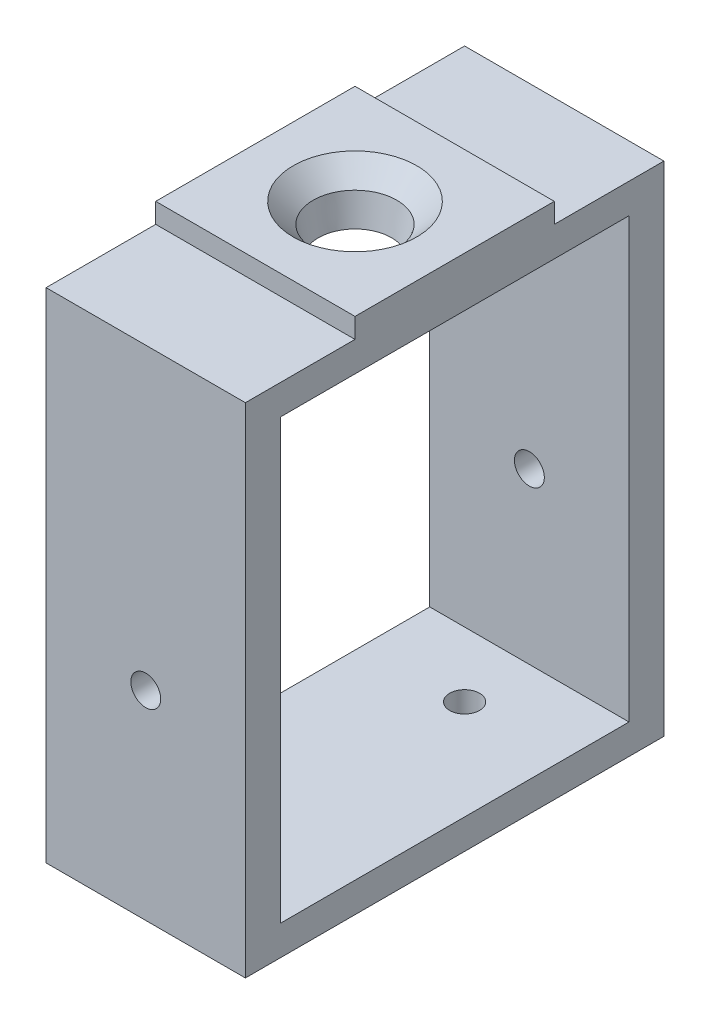
ISO-10303-21;
HEADER;
FILE_DESCRIPTION(('STEP AP214'),'2;1');
FILE_NAME('part.step','',(''),(''),'','','');
FILE_SCHEMA(('AUTOMOTIVE_DESIGN { 1 0 10303 214 1 1 1 1 }'));
ENDSEC;
DATA;
#1=APPLICATION_CONTEXT('core data for automotive mechanical design processes');
#2=APPLICATION_PROTOCOL_DEFINITION('international standard','automotive_design',2000,#1);
#3=PRODUCT_CONTEXT('',#1,'mechanical');
#4=PRODUCT('Part','Part','',(#3));
#5=PRODUCT_RELATED_PRODUCT_CATEGORY('part','',(#4));
#6=PRODUCT_DEFINITION_FORMATION('','',#4);
#7=PRODUCT_DEFINITION_CONTEXT('part definition',#1,'design');
#8=PRODUCT_DEFINITION('design','',#6,#7);
#9=PRODUCT_DEFINITION_SHAPE('','',#8);
#10=(LENGTH_UNIT() NAMED_UNIT(*) SI_UNIT(.MILLI.,.METRE.));
#11=(NAMED_UNIT(*) PLANE_ANGLE_UNIT() SI_UNIT($,.RADIAN.));
#12=(NAMED_UNIT(*) SI_UNIT($,.STERADIAN.) SOLID_ANGLE_UNIT());
#13=UNCERTAINTY_MEASURE_WITH_UNIT(LENGTH_MEASURE(1.E-05),#10,'distance_accuracy_value','');
#14=(GEOMETRIC_REPRESENTATION_CONTEXT(3) GLOBAL_UNCERTAINTY_ASSIGNED_CONTEXT((#13)) GLOBAL_UNIT_ASSIGNED_CONTEXT((#10,
#11,#12)) REPRESENTATION_CONTEXT('',''));
#15=CARTESIAN_POINT('',(0.,0.,0.));
#16=DIRECTION('',(0.,0.,1.));
#17=DIRECTION('',(1.,0.,0.));
#18=AXIS2_PLACEMENT_3D('',#15,#16,#17);
#19=CARTESIAN_POINT('',(0.,50.,0.));
#20=DIRECTION('',(0.,-1.,0.));
#21=DIRECTION('',(0.,0.,-1.));
#22=AXIS2_PLACEMENT_3D('',#19,#20,#21);
#23=PLANE('',#22);
#24=DIRECTION('',(-1.,0.,0.));
#25=VECTOR('',#24,1.);
#26=CARTESIAN_POINT('',(0.,50.,11.));
#27=LINE('',#26,#25);
#28=CARTESIAN_POINT('',(20.,50.,11.));
#29=VERTEX_POINT('',#28);
#30=CARTESIAN_POINT('',(-1.22669731515503E-13,50.,11.));
#31=VERTEX_POINT('',#30);
#32=EDGE_CURVE('E51',#29,#31,#27,.T.);
#33=ORIENTED_EDGE('',*,*,#32,.F.);
#34=DIRECTION('',(0.,0.,-1.));
#35=VECTOR('',#34,1.);
#36=CARTESIAN_POINT('',(20.,50.,42.));
#37=LINE('',#36,#35);
#38=CARTESIAN_POINT('',(20.,50.,0.));
#39=VERTEX_POINT('',#38);
#40=EDGE_CURVE('E188',#29,#39,#37,.T.);
#41=ORIENTED_EDGE('',*,*,#40,.T.);
#42=DIRECTION('',(-1.,0.,0.));
#43=VECTOR('',#42,1.);
#44=CARTESIAN_POINT('',(20.,50.,0.));
#45=LINE('',#44,#43);
#46=CARTESIAN_POINT('',(0.,50.,0.));
#47=VERTEX_POINT('',#46);
#48=EDGE_CURVE('E173',#39,#47,#45,.T.);
#49=ORIENTED_EDGE('',*,*,#48,.T.);
#50=DIRECTION('',(0.,0.,1.));
#51=VECTOR('',#50,1.);
#52=CARTESIAN_POINT('',(0.,50.,42.));
#53=LINE('',#52,#51);
#54=EDGE_CURVE('E183',#47,#31,#53,.T.);
#55=ORIENTED_EDGE('',*,*,#54,.T.);
#56=EDGE_LOOP('',(#33,#41,#49,#55));
#57=FACE_BOUND('',#56,.T.);
#58=ADVANCED_FACE('F35',(#57),#23,.F.);
#59=DIRECTION('',(1.,0.,0.));
#60=VECTOR('',#59,1.);
#61=CARTESIAN_POINT('',(0.,50.,31.));
#62=LINE('',#61,#60);
#63=CARTESIAN_POINT('',(0.,50.,31.));
#64=VERTEX_POINT('',#63);
#65=CARTESIAN_POINT('',(20.,50.,31.));
#66=VERTEX_POINT('',#65);
#67=EDGE_CURVE('E59',#64,#66,#62,.T.);
#68=ORIENTED_EDGE('',*,*,#67,.F.);
#69=CARTESIAN_POINT('',(0.,50.,42.));
#70=VERTEX_POINT('',#69);
#71=EDGE_CURVE('E147',#64,#70,#53,.T.);
#72=ORIENTED_EDGE('',*,*,#71,.T.);
#73=DIRECTION('',(1.,0.,0.));
#74=VECTOR('',#73,1.);
#75=CARTESIAN_POINT('',(0.,50.,42.));
#76=LINE('',#75,#74);
#77=CARTESIAN_POINT('',(20.,50.,42.));
#78=VERTEX_POINT('',#77);
#79=EDGE_CURVE('E185',#70,#78,#76,.T.);
#80=ORIENTED_EDGE('',*,*,#79,.T.);
#81=EDGE_CURVE('E189',#78,#66,#37,.T.);
#82=ORIENTED_EDGE('',*,*,#81,.T.);
#83=EDGE_LOOP('',(#68,#72,#80,#82));
#84=FACE_BOUND('',#83,.T.);
#85=ADVANCED_FACE('F294',(#84),#23,.F.);
#86=CARTESIAN_POINT('',(0.,3.,0.));
#87=DIRECTION('',(0.,1.,0.));
#88=DIRECTION('',(0.,0.,1.));
#89=AXIS2_PLACEMENT_3D('',#86,#87,#88);
#90=PLANE('',#89);
#91=CARTESIAN_POINT('',(10.,3.,10.));
#92=DIRECTION('',(0.,-1.,0.));
#93=DIRECTION('',(0.,0.,-1.));
#94=AXIS2_PLACEMENT_3D('',#91,#92,#93);
#95=CIRCLE('',#94,1.5);
#96=CARTESIAN_POINT('',(10.,3.,8.5));
#97=VERTEX_POINT('',#96);
#98=EDGE_CURVE('E257',#97,#97,#95,.T.);
#99=ORIENTED_EDGE('',*,*,#98,.T.);
#100=EDGE_LOOP('',(#99));
#101=FACE_BOUND('',#100,.T.);
#102=CARTESIAN_POINT('',(10.,3.,32.));
#103=DIRECTION('',(0.,-1.,0.));
#104=DIRECTION('',(0.,0.,-1.));
#105=AXIS2_PLACEMENT_3D('',#102,#103,#104);
#106=CIRCLE('',#105,1.5);
#107=CARTESIAN_POINT('',(10.,3.,30.5));
#108=VERTEX_POINT('',#107);
#109=EDGE_CURVE('E253',#108,#108,#106,.T.);
#110=ORIENTED_EDGE('',*,*,#109,.T.);
#111=EDGE_LOOP('',(#110));
#112=FACE_BOUND('',#111,.T.);
#113=DIRECTION('',(0.,0.,-1.));
#114=VECTOR('',#113,1.);
#115=CARTESIAN_POINT('',(20.,3.,0.));
#116=LINE('',#115,#114);
#117=CARTESIAN_POINT('',(20.,3.,38.5));
#118=VERTEX_POINT('',#117);
#119=CARTESIAN_POINT('',(20.,3.,3.5));
#120=VERTEX_POINT('',#119);
#121=EDGE_CURVE('E201',#118,#120,#116,.T.);
#122=ORIENTED_EDGE('',*,*,#121,.T.);
#123=DIRECTION('',(1.,0.,0.));
#124=VECTOR('',#123,1.);
#125=CARTESIAN_POINT('',(20.,3.,3.5));
#126=LINE('',#125,#124);
#127=CARTESIAN_POINT('',(0.,3.,3.5));
#128=VERTEX_POINT('',#127);
#129=EDGE_CURVE('E172',#128,#120,#126,.T.);
#130=ORIENTED_EDGE('',*,*,#129,.F.);
#131=DIRECTION('',(0.,0.,1.));
#132=VECTOR('',#131,1.);
#133=CARTESIAN_POINT('',(0.,3.,0.));
#134=LINE('',#133,#132);
#135=CARTESIAN_POINT('',(0.,3.,38.5));
#136=VERTEX_POINT('',#135);
#137=EDGE_CURVE('E198',#128,#136,#134,.T.);
#138=ORIENTED_EDGE('',*,*,#137,.T.);
#139=DIRECTION('',(-1.,0.,0.));
#140=VECTOR('',#139,1.);
#141=CARTESIAN_POINT('',(0.,3.,38.5));
#142=LINE('',#141,#140);
#143=EDGE_CURVE('E182',#118,#136,#142,.T.);
#144=ORIENTED_EDGE('',*,*,#143,.F.);
#145=EDGE_LOOP('',(#122,#130,#138,#144));
#146=FACE_BOUND('',#145,.T.);
#147=ADVANCED_FACE('F266',(#101,#112,#146),#90,.T.);
#148=CARTESIAN_POINT('',(0.,3.,0.));
#149=DIRECTION('',(1.,0.,0.));
#150=DIRECTION('',(0.,0.,-1.));
#151=AXIS2_PLACEMENT_3D('',#148,#149,#150);
#152=PLANE('',#151);
#153=DIRECTION('',(0.,0.,-1.));
#154=VECTOR('',#153,1.);
#155=CARTESIAN_POINT('',(0.,47.,38.5));
#156=LINE('',#155,#154);
#157=CARTESIAN_POINT('',(0.,47.,38.5));
#158=VERTEX_POINT('',#157);
#159=CARTESIAN_POINT('',(0.,47.,3.50000000000001));
#160=VERTEX_POINT('',#159);
#161=EDGE_CURVE('E151',#158,#160,#156,.T.);
#162=ORIENTED_EDGE('',*,*,#161,.F.);
#163=DIRECTION('',(0.,-1.,0.));
#164=VECTOR('',#163,1.);
#165=CARTESIAN_POINT('',(0.,50.,38.5));
#166=LINE('',#165,#164);
#167=EDGE_CURVE('E191',#158,#136,#166,.T.);
#168=ORIENTED_EDGE('',*,*,#167,.T.);
#169=ORIENTED_EDGE('',*,*,#137,.F.);
#170=DIRECTION('',(0.,-1.,0.));
#171=VECTOR('',#170,1.);
#172=CARTESIAN_POINT('',(0.,50.,3.5));
#173=LINE('',#172,#171);
#174=EDGE_CURVE('E180',#160,#128,#173,.T.);
#175=ORIENTED_EDGE('',*,*,#174,.F.);
#176=EDGE_LOOP('',(#162,#168,#169,#175));
#177=FACE_BOUND('',#176,.T.);
#178=DIRECTION('',(0.,0.,1.));
#179=VECTOR('',#178,1.);
#180=CARTESIAN_POINT('',(0.,0.,0.));
#181=LINE('',#180,#179);
#182=CARTESIAN_POINT('',(0.,0.,0.));
#183=VERTEX_POINT('',#182);
#184=CARTESIAN_POINT('',(0.,0.,42.));
#185=VERTEX_POINT('',#184);
#186=EDGE_CURVE('E197',#183,#185,#181,.T.);
#187=ORIENTED_EDGE('',*,*,#186,.T.);
#188=DIRECTION('',(0.,-1.,0.));
#189=VECTOR('',#188,1.);
#190=CARTESIAN_POINT('',(0.,3.,42.));
#191=LINE('',#190,#189);
#192=EDGE_CURVE('E11',#70,#185,#191,.T.);
#193=ORIENTED_EDGE('',*,*,#192,.F.);
#194=ORIENTED_EDGE('',*,*,#71,.F.);
#195=DIRECTION('',(0.,-1.,0.));
#196=VECTOR('',#195,1.);
#197=CARTESIAN_POINT('',(0.,52.,31.));
#198=LINE('',#197,#196);
#199=CARTESIAN_POINT('',(0.,52.,31.));
#200=VERTEX_POINT('',#199);
#201=EDGE_CURVE('E129',#200,#64,#198,.T.);
#202=ORIENTED_EDGE('',*,*,#201,.F.);
#203=DIRECTION('',(0.,0.,1.));
#204=VECTOR('',#203,1.);
#205=CARTESIAN_POINT('',(0.,52.,31.));
#206=LINE('',#205,#204);
#207=CARTESIAN_POINT('',(0.,52.,11.));
#208=VERTEX_POINT('',#207);
#209=EDGE_CURVE('E135',#208,#200,#206,.T.);
#210=ORIENTED_EDGE('',*,*,#209,.F.);
#211=DIRECTION('',(0.,-1.,0.));
#212=VECTOR('',#211,1.);
#213=CARTESIAN_POINT('',(0.,52.,11.));
#214=LINE('',#213,#212);
#215=EDGE_CURVE('E233',#208,#31,#214,.T.);
#216=ORIENTED_EDGE('',*,*,#215,.T.);
#217=ORIENTED_EDGE('',*,*,#54,.F.);
#218=DIRECTION('',(0.,-1.,0.));
#219=VECTOR('',#218,1.);
#220=CARTESIAN_POINT('',(0.,3.,0.));
#221=LINE('',#220,#219);
#222=EDGE_CURVE('E205',#47,#183,#221,.T.);
#223=ORIENTED_EDGE('',*,*,#222,.T.);
#224=EDGE_LOOP('',(#187,#193,#194,#202,#210,#216,#217,#223));
#225=FACE_BOUND('',#224,.T.);
#226=ADVANCED_FACE('F37',(#177,#225),#152,.F.);
#227=CARTESIAN_POINT('',(0.,3.,42.));
#228=DIRECTION('',(0.,0.,-1.));
#229=DIRECTION('',(-1.,0.,0.));
#230=AXIS2_PLACEMENT_3D('',#227,#228,#229);
#231=PLANE('',#230);
#232=CARTESIAN_POINT('',(10.,20.,42.));
#233=DIRECTION('',(0.,0.,1.));
#234=DIRECTION('',(1.,0.,0.));
#235=AXIS2_PLACEMENT_3D('',#232,#233,#234);
#236=CIRCLE('',#235,1.5);
#237=CARTESIAN_POINT('',(11.5,20.,42.));
#238=VERTEX_POINT('',#237);
#239=EDGE_CURVE('E161',#238,#238,#236,.T.);
#240=ORIENTED_EDGE('',*,*,#239,.F.);
#241=EDGE_LOOP('',(#240));
#242=FACE_BOUND('',#241,.T.);
#243=DIRECTION('',(1.,0.,0.));
#244=VECTOR('',#243,1.);
#245=CARTESIAN_POINT('',(0.,0.,42.));
#246=LINE('',#245,#244);
#247=CARTESIAN_POINT('',(20.,0.,42.));
#248=VERTEX_POINT('',#247);
#249=EDGE_CURVE('E207',#185,#248,#246,.T.);
#250=ORIENTED_EDGE('',*,*,#249,.T.);
#251=DIRECTION('',(0.,-1.,0.));
#252=VECTOR('',#251,1.);
#253=CARTESIAN_POINT('',(20.,3.,42.));
#254=LINE('',#253,#252);
#255=EDGE_CURVE('E44',#78,#248,#254,.T.);
#256=ORIENTED_EDGE('',*,*,#255,.F.);
#257=ORIENTED_EDGE('',*,*,#79,.F.);
#258=ORIENTED_EDGE('',*,*,#192,.T.);
#259=EDGE_LOOP('',(#250,#256,#257,#258));
#260=FACE_BOUND('',#259,.T.);
#261=ADVANCED_FACE('F312',(#242,#260),#231,.F.);
#262=CARTESIAN_POINT('',(20.,3.,0.));
#263=DIRECTION('',(-1.,0.,0.));
#264=DIRECTION('',(0.,0.,1.));
#265=AXIS2_PLACEMENT_3D('',#262,#263,#264);
#266=PLANE('',#265);
#267=DIRECTION('',(0.,-1.,0.));
#268=VECTOR('',#267,1.);
#269=CARTESIAN_POINT('',(20.,50.,38.5));
#270=LINE('',#269,#268);
#271=CARTESIAN_POINT('',(20.,47.,38.5));
#272=VERTEX_POINT('',#271);
#273=EDGE_CURVE('E195',#272,#118,#270,.T.);
#274=ORIENTED_EDGE('',*,*,#273,.F.);
#275=DIRECTION('',(0.,0.,-1.));
#276=VECTOR('',#275,1.);
#277=CARTESIAN_POINT('',(20.,47.,38.5));
#278=LINE('',#277,#276);
#279=CARTESIAN_POINT('',(20.,47.,3.5));
#280=VERTEX_POINT('',#279);
#281=EDGE_CURVE('E148',#272,#280,#278,.T.);
#282=ORIENTED_EDGE('',*,*,#281,.T.);
#283=DIRECTION('',(0.,-1.,0.));
#284=VECTOR('',#283,1.);
#285=CARTESIAN_POINT('',(20.,50.,3.5));
#286=LINE('',#285,#284);
#287=EDGE_CURVE('E176',#280,#120,#286,.T.);
#288=ORIENTED_EDGE('',*,*,#287,.T.);
#289=ORIENTED_EDGE('',*,*,#121,.F.);
#290=EDGE_LOOP('',(#274,#282,#288,#289));
#291=FACE_BOUND('',#290,.T.);
#292=DIRECTION('',(0.,0.,-1.));
#293=VECTOR('',#292,1.);
#294=CARTESIAN_POINT('',(20.,0.,0.));
#295=LINE('',#294,#293);
#296=CARTESIAN_POINT('',(20.,0.,0.));
#297=VERTEX_POINT('',#296);
#298=EDGE_CURVE('E209',#248,#297,#295,.T.);
#299=ORIENTED_EDGE('',*,*,#298,.T.);
#300=DIRECTION('',(0.,-1.,0.));
#301=VECTOR('',#300,1.);
#302=CARTESIAN_POINT('',(20.,3.,0.));
#303=LINE('',#302,#301);
#304=EDGE_CURVE('E214',#39,#297,#303,.T.);
#305=ORIENTED_EDGE('',*,*,#304,.F.);
#306=ORIENTED_EDGE('',*,*,#40,.F.);
#307=DIRECTION('',(0.,-1.,0.));
#308=VECTOR('',#307,1.);
#309=CARTESIAN_POINT('',(20.,52.,11.));
#310=LINE('',#309,#308);
#311=CARTESIAN_POINT('',(20.,52.,11.));
#312=VERTEX_POINT('',#311);
#313=EDGE_CURVE('E153',#312,#29,#310,.T.);
#314=ORIENTED_EDGE('',*,*,#313,.F.);
#315=DIRECTION('',(0.,0.,-1.));
#316=VECTOR('',#315,1.);
#317=CARTESIAN_POINT('',(20.,52.,31.));
#318=LINE('',#317,#316);
#319=CARTESIAN_POINT('',(20.,52.,31.));
#320=VERTEX_POINT('',#319);
#321=EDGE_CURVE('E134',#320,#312,#318,.T.);
#322=ORIENTED_EDGE('',*,*,#321,.F.);
#323=DIRECTION('',(0.,-1.,0.));
#324=VECTOR('',#323,1.);
#325=CARTESIAN_POINT('',(20.,52.,31.));
#326=LINE('',#325,#324);
#327=EDGE_CURVE('E131',#320,#66,#326,.T.);
#328=ORIENTED_EDGE('',*,*,#327,.T.);
#329=ORIENTED_EDGE('',*,*,#81,.F.);
#330=ORIENTED_EDGE('',*,*,#255,.T.);
#331=EDGE_LOOP('',(#299,#305,#306,#314,#322,#328,#329,#330));
#332=FACE_BOUND('',#331,.T.);
#333=ADVANCED_FACE('F221',(#291,#332),#266,.F.);
#334=CARTESIAN_POINT('',(0.,3.,0.));
#335=DIRECTION('',(0.,0.,1.));
#336=DIRECTION('',(1.,0.,0.));
#337=AXIS2_PLACEMENT_3D('',#334,#335,#336);
#338=PLANE('',#337);
#339=CARTESIAN_POINT('',(10.,20.,0.));
#340=DIRECTION('',(0.,0.,1.));
#341=DIRECTION('',(1.,0.,0.));
#342=AXIS2_PLACEMENT_3D('',#339,#340,#341);
#343=CIRCLE('',#342,1.5);
#344=CARTESIAN_POINT('',(11.5,20.,0.));
#345=VERTEX_POINT('',#344);
#346=EDGE_CURVE('E164',#345,#345,#343,.T.);
#347=ORIENTED_EDGE('',*,*,#346,.T.);
#348=EDGE_LOOP('',(#347));
#349=FACE_BOUND('',#348,.T.);
#350=DIRECTION('',(-1.,0.,0.));
#351=VECTOR('',#350,1.);
#352=CARTESIAN_POINT('',(0.,0.,0.));
#353=LINE('',#352,#351);
#354=EDGE_CURVE('E202',#297,#183,#353,.T.);
#355=ORIENTED_EDGE('',*,*,#354,.T.);
#356=ORIENTED_EDGE('',*,*,#222,.F.);
#357=ORIENTED_EDGE('',*,*,#48,.F.);
#358=ORIENTED_EDGE('',*,*,#304,.T.);
#359=EDGE_LOOP('',(#355,#356,#357,#358));
#360=FACE_BOUND('',#359,.T.);
#361=ADVANCED_FACE('F231',(#349,#360),#338,.F.);
#362=CARTESIAN_POINT('',(0.,0.,0.));
#363=DIRECTION('',(0.,1.,0.));
#364=DIRECTION('',(0.,0.,1.));
#365=AXIS2_PLACEMENT_3D('',#362,#363,#364);
#366=PLANE('',#365);
#367=CARTESIAN_POINT('',(10.,0.,10.));
#368=DIRECTION('',(0.,-1.,0.));
#369=DIRECTION('',(0.,0.,-1.));
#370=AXIS2_PLACEMENT_3D('',#367,#368,#369);
#371=CIRCLE('',#370,1.5);
#372=CARTESIAN_POINT('',(10.,0.,8.5));
#373=VERTEX_POINT('',#372);
#374=EDGE_CURVE('E260',#373,#373,#371,.T.);
#375=ORIENTED_EDGE('',*,*,#374,.F.);
#376=EDGE_LOOP('',(#375));
#377=FACE_BOUND('',#376,.T.);
#378=CARTESIAN_POINT('',(10.,0.,32.));
#379=DIRECTION('',(0.,-1.,0.));
#380=DIRECTION('',(0.,0.,-1.));
#381=AXIS2_PLACEMENT_3D('',#378,#379,#380);
#382=CIRCLE('',#381,1.5);
#383=CARTESIAN_POINT('',(10.,0.,30.5));
#384=VERTEX_POINT('',#383);
#385=EDGE_CURVE('E254',#384,#384,#382,.T.);
#386=ORIENTED_EDGE('',*,*,#385,.F.);
#387=EDGE_LOOP('',(#386));
#388=FACE_BOUND('',#387,.T.);
#389=ORIENTED_EDGE('',*,*,#186,.F.);
#390=ORIENTED_EDGE('',*,*,#354,.F.);
#391=ORIENTED_EDGE('',*,*,#298,.F.);
#392=ORIENTED_EDGE('',*,*,#249,.F.);
#393=EDGE_LOOP('',(#389,#390,#391,#392));
#394=FACE_BOUND('',#393,.T.);
#395=ADVANCED_FACE('F228',(#377,#388,#394),#366,.F.);
#396=CARTESIAN_POINT('',(0.,50.,38.5));
#397=DIRECTION('',(0.,0.,1.));
#398=DIRECTION('',(1.,0.,0.));
#399=AXIS2_PLACEMENT_3D('',#396,#397,#398);
#400=PLANE('',#399);
#401=CARTESIAN_POINT('',(10.,20.,38.5));
#402=DIRECTION('',(0.,0.,1.));
#403=DIRECTION('',(1.,0.,0.));
#404=AXIS2_PLACEMENT_3D('',#401,#402,#403);
#405=CIRCLE('',#404,1.5);
#406=CARTESIAN_POINT('',(11.5,20.,38.5));
#407=VERTEX_POINT('',#406);
#408=EDGE_CURVE('E169',#407,#407,#405,.T.);
#409=ORIENTED_EDGE('',*,*,#408,.T.);
#410=EDGE_LOOP('',(#409));
#411=FACE_BOUND('',#410,.T.);
#412=ORIENTED_EDGE('',*,*,#167,.F.);
#413=DIRECTION('',(1.,0.,0.));
#414=VECTOR('',#413,1.);
#415=CARTESIAN_POINT('',(0.,47.,38.5));
#416=LINE('',#415,#414);
#417=EDGE_CURVE('E157',#158,#272,#416,.T.);
#418=ORIENTED_EDGE('',*,*,#417,.T.);
#419=ORIENTED_EDGE('',*,*,#273,.T.);
#420=ORIENTED_EDGE('',*,*,#143,.T.);
#421=EDGE_LOOP('',(#412,#418,#419,#420));
#422=FACE_BOUND('',#421,.T.);
#423=ADVANCED_FACE('F278',(#411,#422),#400,.F.);
#424=CARTESIAN_POINT('',(20.,50.,3.5));
#425=DIRECTION('',(0.,0.,-1.));
#426=DIRECTION('',(-1.,0.,0.));
#427=AXIS2_PLACEMENT_3D('',#424,#425,#426);
#428=PLANE('',#427);
#429=CARTESIAN_POINT('',(10.,20.,3.5));
#430=DIRECTION('',(0.,0.,-1.));
#431=DIRECTION('',(-1.,0.,0.));
#432=AXIS2_PLACEMENT_3D('',#429,#430,#431);
#433=CIRCLE('',#432,1.5);
#434=CARTESIAN_POINT('',(11.5,20.,3.5));
#435=VERTEX_POINT('',#434);
#436=EDGE_CURVE('E39',#435,#435,#433,.T.);
#437=ORIENTED_EDGE('',*,*,#436,.T.);
#438=EDGE_LOOP('',(#437));
#439=FACE_BOUND('',#438,.T.);
#440=ORIENTED_EDGE('',*,*,#287,.F.);
#441=DIRECTION('',(1.,0.,0.));
#442=VECTOR('',#441,1.);
#443=CARTESIAN_POINT('',(0.,47.,3.50000000000001));
#444=LINE('',#443,#442);
#445=EDGE_CURVE('E159',#160,#280,#444,.T.);
#446=ORIENTED_EDGE('',*,*,#445,.F.);
#447=ORIENTED_EDGE('',*,*,#174,.T.);
#448=ORIENTED_EDGE('',*,*,#129,.T.);
#449=EDGE_LOOP('',(#440,#446,#447,#448));
#450=FACE_BOUND('',#449,.T.);
#451=ADVANCED_FACE('F301',(#439,#450),#428,.F.);
#452=CARTESIAN_POINT('',(10.,20.,0.));
#453=DIRECTION('',(0.,0.,1.));
#454=DIRECTION('',(1.,0.,0.));
#455=AXIS2_PLACEMENT_3D('',#452,#453,#454);
#456=CYLINDRICAL_SURFACE('',#455,1.5);
#457=CARTESIAN_POINT('',(11.5,20.,0.));
#458=CARTESIAN_POINT('',(11.5,20.,0.0364583333333335));
#459=CARTESIAN_POINT('',(11.5,20.,0.0729166666666667));
#460=CARTESIAN_POINT('',(11.5,20.,0.145833333333333));
#461=CARTESIAN_POINT('',(11.5,20.,0.182291666666667));
#462=CARTESIAN_POINT('',(11.5,20.,0.255208333333333));
#463=CARTESIAN_POINT('',(11.5,20.,0.291666666666667));
#464=CARTESIAN_POINT('',(11.5,20.,0.364583333333333));
#465=CARTESIAN_POINT('',(11.5,20.,0.401041666666667));
#466=CARTESIAN_POINT('',(11.5,20.,0.473958333333333));
#467=CARTESIAN_POINT('',(11.5,20.,0.510416666666667));
#468=CARTESIAN_POINT('',(11.5,20.,0.583333333333333));
#469=CARTESIAN_POINT('',(11.5,20.,0.619791666666667));
#470=CARTESIAN_POINT('',(11.5,20.,0.692708333333333));
#471=CARTESIAN_POINT('',(11.5,20.,0.729166666666667));
#472=CARTESIAN_POINT('',(11.5,20.,0.802083333333333));
#473=CARTESIAN_POINT('',(11.5,20.,0.838541666666667));
#474=CARTESIAN_POINT('',(11.5,20.,0.911458333333334));
#475=CARTESIAN_POINT('',(11.5,20.,0.947916666666667));
#476=CARTESIAN_POINT('',(11.5,20.,1.02083333333333));
#477=CARTESIAN_POINT('',(11.5,20.,1.05729166666667));
#478=CARTESIAN_POINT('',(11.5,20.,1.13020833333333));
#479=CARTESIAN_POINT('',(11.5,20.,1.16666666666667));
#480=CARTESIAN_POINT('',(11.5,20.,1.23958333333333));
#481=CARTESIAN_POINT('',(11.5,20.,1.27604166666667));
#482=CARTESIAN_POINT('',(11.5,20.,1.34895833333333));
#483=CARTESIAN_POINT('',(11.5,20.,1.38541666666667));
#484=CARTESIAN_POINT('',(11.5,20.,1.45833333333333));
#485=CARTESIAN_POINT('',(11.5,20.,1.49479166666667));
#486=CARTESIAN_POINT('',(11.5,20.,1.56770833333333));
#487=CARTESIAN_POINT('',(11.5,20.,1.60416666666667));
#488=CARTESIAN_POINT('',(11.5,20.,1.67708333333333));
#489=CARTESIAN_POINT('',(11.5,20.,1.71354166666667));
#490=CARTESIAN_POINT('',(11.5,20.,1.78645833333333));
#491=CARTESIAN_POINT('',(11.5,20.,1.82291666666667));
#492=CARTESIAN_POINT('',(11.5,20.,1.89583333333333));
#493=CARTESIAN_POINT('',(11.5,20.,1.93229166666667));
#494=CARTESIAN_POINT('',(11.5,20.,2.00520833333333));
#495=CARTESIAN_POINT('',(11.5,20.,2.04166666666667));
#496=CARTESIAN_POINT('',(11.5,20.,2.11458333333333));
#497=CARTESIAN_POINT('',(11.5,20.,2.15104166666667));
#498=CARTESIAN_POINT('',(11.5,20.,2.22395833333333));
#499=CARTESIAN_POINT('',(11.5,20.,2.26041666666667));
#500=CARTESIAN_POINT('',(11.5,20.,2.33333333333333));
#501=CARTESIAN_POINT('',(11.5,20.,2.36979166666667));
#502=CARTESIAN_POINT('',(11.5,20.,2.44270833333333));
#503=CARTESIAN_POINT('',(11.5,20.,2.47916666666667));
#504=CARTESIAN_POINT('',(11.5,20.,2.55208333333333));
#505=CARTESIAN_POINT('',(11.5,20.,2.58854166666667));
#506=CARTESIAN_POINT('',(11.5,20.,2.66145833333333));
#507=CARTESIAN_POINT('',(11.5,20.,2.69791666666667));
#508=CARTESIAN_POINT('',(11.5,20.,2.77083333333333));
#509=CARTESIAN_POINT('',(11.5,20.,2.80729166666667));
#510=CARTESIAN_POINT('',(11.5,20.,2.88020833333333));
#511=CARTESIAN_POINT('',(11.5,20.,2.91666666666667));
#512=CARTESIAN_POINT('',(11.5,20.,2.98958333333333));
#513=CARTESIAN_POINT('',(11.5,20.,3.02604166666667));
#514=CARTESIAN_POINT('',(11.5,20.,3.09895833333333));
#515=CARTESIAN_POINT('',(11.5,20.,3.13541666666667));
#516=CARTESIAN_POINT('',(11.5,20.,3.20833333333333));
#517=CARTESIAN_POINT('',(11.5,20.,3.24479166666667));
#518=CARTESIAN_POINT('',(11.5,20.,3.31770833333333));
#519=CARTESIAN_POINT('',(11.5,20.,3.35416666666667));
#520=CARTESIAN_POINT('',(11.5,20.,3.42708333333333));
#521=CARTESIAN_POINT('',(11.5,20.,3.46354166666667));
#522=CARTESIAN_POINT('',(11.5,20.,3.5));
#523=B_SPLINE_CURVE_WITH_KNOTS('',3,(#457,#458,#459,#460,#461,#462,#463,#464,#465,#466,#467,
#468,#469,#470,#471,#472,#473,#474,#475,#476,#477,#478,#479,#480,#481,#482,#483,#484,#485,#486,
#487,#488,#489,#490,#491,#492,#493,#494,#495,#496,#497,#498,#499,#500,#501,#502,#503,#504,#505,
#506,#507,#508,#509,#510,#511,#512,#513,#514,#515,#516,#517,#518,#519,#520,#521,#522),
.UNSPECIFIED.,.F.,.F.,(4,2,2,2,2,2,2,2,2,2,2,2,2,2,2,2,2,2,2,2,2,2,2,2,2,2,2,2,2,2,2,2,4),(0.,
0.109375,0.21875,0.328125,0.4375,0.546875,0.65625,0.765625,0.875,0.984375,1.09375,1.203125,
1.3125,1.421875,1.53125,1.640625,1.75,1.859375,1.96875,2.078125,2.1875,2.296875,2.40625,
2.515625,2.625,2.734375,2.84375,2.953125,3.0625,3.171875,3.28125,3.390625,3.5),.UNSPECIFIED.);
#524=EDGE_CURVE('BSEAM326',#345,#435,#523,.T.);
#525=ORIENTED_EDGE('',*,*,#346,.F.);
#526=ORIENTED_EDGE('',*,*,#436,.F.);
#527=ORIENTED_EDGE('',*,*,#524,.T.);
#528=ORIENTED_EDGE('',*,*,#524,.F.);
#529=EDGE_LOOP('',(#525,#527,#526,#528));
#530=FACE_BOUND('',#529,.T.);
#531=ADVANCED_FACE('F326',(#530),#456,.F.);
#532=CARTESIAN_POINT('',(11.5,20.,42.));
#533=CARTESIAN_POINT('',(11.5,20.,41.9635416666667));
#534=CARTESIAN_POINT('',(11.5,20.,41.9270833333333));
#535=CARTESIAN_POINT('',(11.5,20.,41.8541666666667));
#536=CARTESIAN_POINT('',(11.5,20.,41.8177083333333));
#537=CARTESIAN_POINT('',(11.5,20.,41.7447916666667));
#538=CARTESIAN_POINT('',(11.5,20.,41.7083333333333));
#539=CARTESIAN_POINT('',(11.5,20.,41.6354166666667));
#540=CARTESIAN_POINT('',(11.5,20.,41.5989583333333));
#541=CARTESIAN_POINT('',(11.5,20.,41.5260416666667));
#542=CARTESIAN_POINT('',(11.5,20.,41.4895833333333));
#543=CARTESIAN_POINT('',(11.5,20.,41.4166666666667));
#544=CARTESIAN_POINT('',(11.5,20.,41.3802083333333));
#545=CARTESIAN_POINT('',(11.5,20.,41.3072916666667));
#546=CARTESIAN_POINT('',(11.5,20.,41.2708333333333));
#547=CARTESIAN_POINT('',(11.5,20.,41.1979166666667));
#548=CARTESIAN_POINT('',(11.5,20.,41.1614583333333));
#549=CARTESIAN_POINT('',(11.5,20.,41.0885416666667));
#550=CARTESIAN_POINT('',(11.5,20.,41.0520833333333));
#551=CARTESIAN_POINT('',(11.5,20.,40.9791666666667));
#552=CARTESIAN_POINT('',(11.5,20.,40.9427083333333));
#553=CARTESIAN_POINT('',(11.5,20.,40.8697916666667));
#554=CARTESIAN_POINT('',(11.5,20.,40.8333333333333));
#555=CARTESIAN_POINT('',(11.5,20.,40.7604166666667));
#556=CARTESIAN_POINT('',(11.5,20.,40.7239583333333));
#557=CARTESIAN_POINT('',(11.5,20.,40.6510416666667));
#558=CARTESIAN_POINT('',(11.5,20.,40.6145833333333));
#559=CARTESIAN_POINT('',(11.5,20.,40.5416666666667));
#560=CARTESIAN_POINT('',(11.5,20.,40.5052083333333));
#561=CARTESIAN_POINT('',(11.5,20.,40.4322916666667));
#562=CARTESIAN_POINT('',(11.5,20.,40.3958333333333));
#563=CARTESIAN_POINT('',(11.5,20.,40.3229166666667));
#564=CARTESIAN_POINT('',(11.5,20.,40.2864583333333));
#565=CARTESIAN_POINT('',(11.5,20.,40.2135416666667));
#566=CARTESIAN_POINT('',(11.5,20.,40.1770833333333));
#567=CARTESIAN_POINT('',(11.5,20.,40.1041666666667));
#568=CARTESIAN_POINT('',(11.5,20.,40.0677083333333));
#569=CARTESIAN_POINT('',(11.5,20.,39.9947916666667));
#570=CARTESIAN_POINT('',(11.5,20.,39.9583333333333));
#571=CARTESIAN_POINT('',(11.5,20.,39.8854166666667));
#572=CARTESIAN_POINT('',(11.5,20.,39.8489583333333));
#573=CARTESIAN_POINT('',(11.5,20.,39.7760416666667));
#574=CARTESIAN_POINT('',(11.5,20.,39.7395833333333));
#575=CARTESIAN_POINT('',(11.5,20.,39.6666666666667));
#576=CARTESIAN_POINT('',(11.5,20.,39.6302083333333));
#577=CARTESIAN_POINT('',(11.5,20.,39.5572916666667));
#578=CARTESIAN_POINT('',(11.5,20.,39.5208333333333));
#579=CARTESIAN_POINT('',(11.5,20.,39.4479166666667));
#580=CARTESIAN_POINT('',(11.5,20.,39.4114583333333));
#581=CARTESIAN_POINT('',(11.5,20.,39.3385416666667));
#582=CARTESIAN_POINT('',(11.5,20.,39.3020833333333));
#583=CARTESIAN_POINT('',(11.5,20.,39.2291666666667));
#584=CARTESIAN_POINT('',(11.5,20.,39.1927083333333));
#585=CARTESIAN_POINT('',(11.5,20.,39.1197916666667));
#586=CARTESIAN_POINT('',(11.5,20.,39.0833333333333));
#587=CARTESIAN_POINT('',(11.5,20.,39.0104166666667));
#588=CARTESIAN_POINT('',(11.5,20.,38.9739583333333));
#589=CARTESIAN_POINT('',(11.5,20.,38.9010416666667));
#590=CARTESIAN_POINT('',(11.5,20.,38.8645833333333));
#591=CARTESIAN_POINT('',(11.5,20.,38.7916666666667));
#592=CARTESIAN_POINT('',(11.5,20.,38.7552083333333));
#593=CARTESIAN_POINT('',(11.5,20.,38.6822916666667));
#594=CARTESIAN_POINT('',(11.5,20.,38.6458333333333));
#595=CARTESIAN_POINT('',(11.5,20.,38.5729166666667));
#596=CARTESIAN_POINT('',(11.5,20.,38.5364583333333));
#597=CARTESIAN_POINT('',(11.5,20.,38.5));
#598=B_SPLINE_CURVE_WITH_KNOTS('',3,(#532,#533,#534,#535,#536,#537,#538,#539,#540,#541,#542,
#543,#544,#545,#546,#547,#548,#549,#550,#551,#552,#553,#554,#555,#556,#557,#558,#559,#560,#561,
#562,#563,#564,#565,#566,#567,#568,#569,#570,#571,#572,#573,#574,#575,#576,#577,#578,#579,#580,
#581,#582,#583,#584,#585,#586,#587,#588,#589,#590,#591,#592,#593,#594,#595,#596,#597),
.UNSPECIFIED.,.F.,.F.,(4,2,2,2,2,2,2,2,2,2,2,2,2,2,2,2,2,2,2,2,2,2,2,2,2,2,2,2,2,2,2,2,4),(0.,
0.109375000000002,0.218750000000004,0.328124999999999,0.4375,0.546875000000002,
0.656249999999997,0.765624999999999,0.875000000000001,0.984375000000003,1.09375,1.203125,1.3125,
1.421875,1.53125,1.640625,1.75,1.859375,1.96875000000001,2.078125,2.1875,2.296875,2.40625,
2.515625,2.625,2.734375,2.84375000000001,2.953125,3.0625,3.171875,3.28125,3.390625,3.5),.UNSPECIFIED.);
#599=EDGE_CURVE('BSEAM322',#238,#407,#598,.T.);
#600=ORIENTED_EDGE('',*,*,#239,.T.);
#601=ORIENTED_EDGE('',*,*,#408,.F.);
#602=ORIENTED_EDGE('',*,*,#599,.T.);
#603=ORIENTED_EDGE('',*,*,#599,.F.);
#604=EDGE_LOOP('',(#600,#602,#601,#603));
#605=FACE_BOUND('',#604,.T.);
#606=ADVANCED_FACE('F322',(#605),#456,.F.);
#607=CARTESIAN_POINT('',(0.,47.,38.5));
#608=DIRECTION('',(0.,-1.,0.));
#609=DIRECTION('',(0.,0.,-1.));
#610=AXIS2_PLACEMENT_3D('',#607,#608,#609);
#611=PLANE('',#610);
#612=CARTESIAN_POINT('',(10.,47.,21.));
#613=DIRECTION('',(0.,1.,0.));
#614=DIRECTION('',(0.,0.,1.));
#615=AXIS2_PLACEMENT_3D('',#612,#613,#614);
#616=CIRCLE('',#615,3.6710190578746);
#617=CARTESIAN_POINT('',(10.,47.,24.6710190578746));
#618=VERTEX_POINT('',#617);
#619=EDGE_CURVE('E247',#618,#618,#616,.T.);
#620=ORIENTED_EDGE('',*,*,#619,.T.);
#621=EDGE_LOOP('',(#620));
#622=FACE_BOUND('',#621,.T.);
#623=ORIENTED_EDGE('',*,*,#281,.F.);
#624=ORIENTED_EDGE('',*,*,#417,.F.);
#625=ORIENTED_EDGE('',*,*,#161,.T.);
#626=ORIENTED_EDGE('',*,*,#445,.T.);
#627=EDGE_LOOP('',(#623,#624,#625,#626));
#628=FACE_BOUND('',#627,.T.);
#629=ADVANCED_FACE('F325',(#622,#628),#611,.T.);
#630=CARTESIAN_POINT('',(0.,52.,31.));
#631=DIRECTION('',(0.,0.,-1.));
#632=DIRECTION('',(-1.,0.,0.));
#633=AXIS2_PLACEMENT_3D('',#630,#631,#632);
#634=PLANE('',#633);
#635=ORIENTED_EDGE('',*,*,#67,.T.);
#636=ORIENTED_EDGE('',*,*,#327,.F.);
#637=DIRECTION('',(1.,0.,0.));
#638=VECTOR('',#637,1.);
#639=CARTESIAN_POINT('',(0.,52.,31.));
#640=LINE('',#639,#638);
#641=EDGE_CURVE('E125',#200,#320,#640,.T.);
#642=ORIENTED_EDGE('',*,*,#641,.F.);
#643=ORIENTED_EDGE('',*,*,#201,.T.);
#644=EDGE_LOOP('',(#635,#636,#642,#643));
#645=FACE_BOUND('',#644,.T.);
#646=ADVANCED_FACE('F127',(#645),#634,.F.);
#647=CARTESIAN_POINT('',(0.,52.,11.));
#648=DIRECTION('',(0.,0.,1.));
#649=DIRECTION('',(1.,0.,0.));
#650=AXIS2_PLACEMENT_3D('',#647,#648,#649);
#651=PLANE('',#650);
#652=ORIENTED_EDGE('',*,*,#32,.T.);
#653=ORIENTED_EDGE('',*,*,#215,.F.);
#654=DIRECTION('',(-1.,0.,0.));
#655=VECTOR('',#654,1.);
#656=CARTESIAN_POINT('',(0.,52.,11.));
#657=LINE('',#656,#655);
#658=EDGE_CURVE('E140',#312,#208,#657,.T.);
#659=ORIENTED_EDGE('',*,*,#658,.F.);
#660=ORIENTED_EDGE('',*,*,#313,.T.);
#661=EDGE_LOOP('',(#652,#653,#659,#660));
#662=FACE_BOUND('',#661,.T.);
#663=ADVANCED_FACE('F236',(#662),#651,.F.);
#664=CARTESIAN_POINT('',(0.,52.,0.));
#665=DIRECTION('',(0.,-1.,0.));
#666=DIRECTION('',(0.,0.,-1.));
#667=AXIS2_PLACEMENT_3D('',#664,#665,#666);
#668=PLANE('',#667);
#669=CARTESIAN_POINT('',(10.,52.,21.));
#670=DIRECTION('',(0.,1.,0.));
#671=DIRECTION('',(0.,0.,1.));
#672=AXIS2_PLACEMENT_3D('',#669,#670,#671);
#673=CIRCLE('',#672,6.2);
#674=CARTESIAN_POINT('',(10.,52.,27.2));
#675=VERTEX_POINT('',#674);
#676=EDGE_CURVE('E239',#675,#675,#673,.T.);
#677=ORIENTED_EDGE('',*,*,#676,.F.);
#678=EDGE_LOOP('',(#677));
#679=FACE_BOUND('',#678,.T.);
#680=ORIENTED_EDGE('',*,*,#209,.T.);
#681=ORIENTED_EDGE('',*,*,#641,.T.);
#682=ORIENTED_EDGE('',*,*,#321,.T.);
#683=ORIENTED_EDGE('',*,*,#658,.T.);
#684=EDGE_LOOP('',(#680,#681,#682,#683));
#685=FACE_BOUND('',#684,.T.);
#686=ADVANCED_FACE('F138',(#679,#685),#668,.F.);
#687=CARTESIAN_POINT('',(10.,52.,21.));
#688=DIRECTION('',(0.,1.,0.));
#689=DIRECTION('',(0.,0.,1.));
#690=AXIS2_PLACEMENT_3D('',#687,#688,#689);
#691=CONICAL_SURFACE('',#690,6.2,0.785398163397449);
#692=CARTESIAN_POINT('',(10.,50.,21.));
#693=DIRECTION('',(0.,1.,0.));
#694=DIRECTION('',(0.,0.,1.));
#695=AXIS2_PLACEMENT_3D('',#692,#693,#694);
#696=CIRCLE('',#695,4.19999999999999);
#697=CARTESIAN_POINT('',(10.,50.,25.2));
#698=VERTEX_POINT('',#697);
#699=EDGE_CURVE('E250',#698,#698,#696,.T.);
#700=ORIENTED_EDGE('',*,*,#699,.F.);
#701=EDGE_LOOP('',(#700));
#702=FACE_BOUND('',#701,.T.);
#703=ORIENTED_EDGE('',*,*,#676,.T.);
#704=EDGE_LOOP('',(#703));
#705=FACE_BOUND('',#704,.T.);
#706=ADVANCED_FACE('F289',(#702,#705),#691,.F.);
#707=CARTESIAN_POINT('',(10.,50.,21.));
#708=DIRECTION('',(0.,1.,0.));
#709=DIRECTION('',(0.,0.,1.));
#710=AXIS2_PLACEMENT_3D('',#707,#708,#709);
#711=CONICAL_SURFACE('',#710,4.19999999999999,0.174532925199433);
#712=ORIENTED_EDGE('',*,*,#619,.F.);
#713=EDGE_LOOP('',(#712));
#714=FACE_BOUND('',#713,.T.);
#715=ORIENTED_EDGE('',*,*,#699,.T.);
#716=EDGE_LOOP('',(#715));
#717=FACE_BOUND('',#716,.T.);
#718=ADVANCED_FACE('F283',(#714,#717),#711,.F.);
#719=CARTESIAN_POINT('',(10.,3.,32.));
#720=DIRECTION('',(0.,-1.,0.));
#721=DIRECTION('',(0.,0.,-1.));
#722=AXIS2_PLACEMENT_3D('',#719,#720,#721);
#723=CYLINDRICAL_SURFACE('',#722,1.5);
#724=ORIENTED_EDGE('',*,*,#109,.F.);
#725=EDGE_LOOP('',(#724));
#726=FACE_BOUND('',#725,.T.);
#727=ORIENTED_EDGE('',*,*,#385,.T.);
#728=EDGE_LOOP('',(#727));
#729=FACE_BOUND('',#728,.T.);
#730=ADVANCED_FACE('F272',(#726,#729),#723,.F.);
#731=CARTESIAN_POINT('',(10.,3.,10.));
#732=DIRECTION('',(0.,-1.,0.));
#733=DIRECTION('',(0.,0.,-1.));
#734=AXIS2_PLACEMENT_3D('',#731,#732,#733);
#735=CYLINDRICAL_SURFACE('',#734,1.5);
#736=ORIENTED_EDGE('',*,*,#98,.F.);
#737=EDGE_LOOP('',(#736));
#738=FACE_BOUND('',#737,.T.);
#739=ORIENTED_EDGE('',*,*,#374,.T.);
#740=EDGE_LOOP('',(#739));
#741=FACE_BOUND('',#740,.T.);
#742=ADVANCED_FACE('F269',(#738,#741),#735,.F.);
#743=CLOSED_SHELL('',(#58,#85,#147,#226,#261,#333,#361,#395,#423,#451,#531,#606,#629,#646,#663,
#686,#706,#718,#730,#742));
#744=MANIFOLD_SOLID_BREP('B2',#743);
#745=ADVANCED_BREP_SHAPE_REPRESENTATION('',(#18,#744),#14);
#746=SHAPE_DEFINITION_REPRESENTATION(#9,#745);
ENDSEC;
END-ISO-10303-21;
